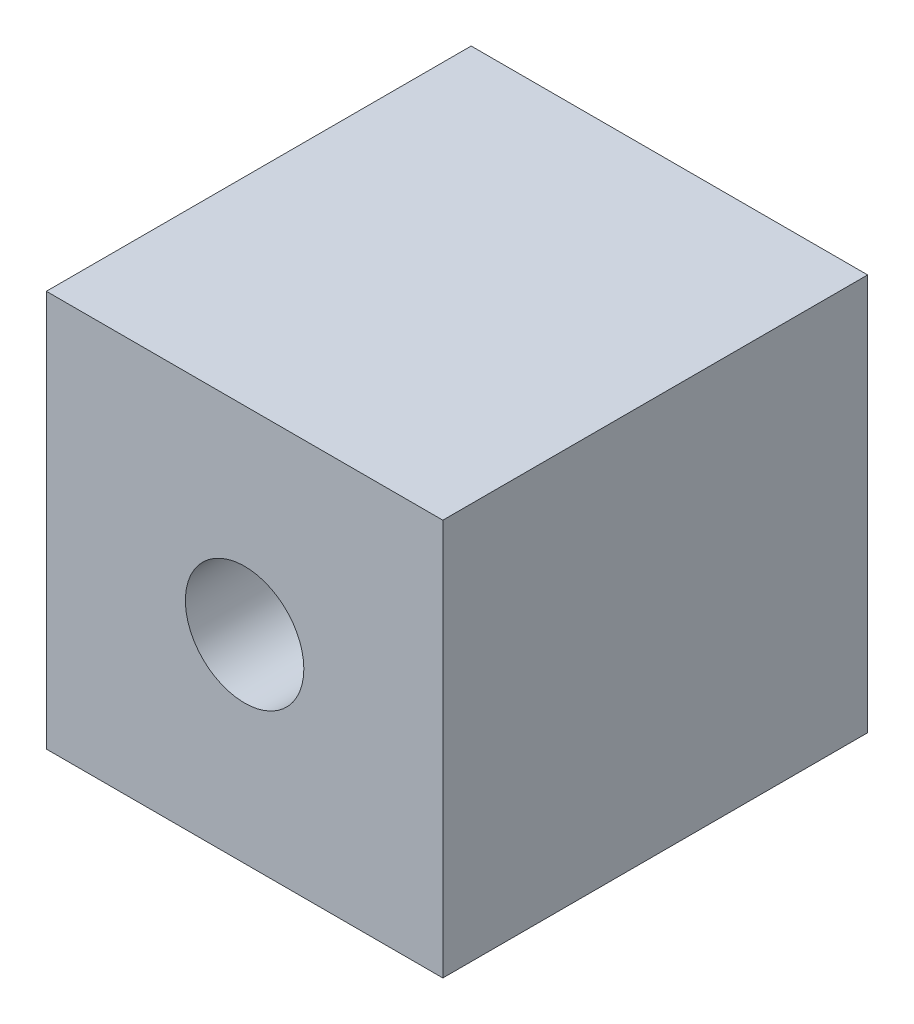
ISO-10303-21;
HEADER;
FILE_DESCRIPTION(('STEP AP214'),'2;1');
FILE_NAME('part.step','',(''),(''),'','','');
FILE_SCHEMA(('AUTOMOTIVE_DESIGN { 1 0 10303 214 1 1 1 1 }'));
ENDSEC;
DATA;
#1=APPLICATION_CONTEXT('core data for automotive mechanical design processes');
#2=APPLICATION_PROTOCOL_DEFINITION('international standard','automotive_design',2000,#1);
#3=PRODUCT_CONTEXT('',#1,'mechanical');
#4=PRODUCT('Part','Part','',(#3));
#5=PRODUCT_RELATED_PRODUCT_CATEGORY('part','',(#4));
#6=PRODUCT_DEFINITION_FORMATION('','',#4);
#7=PRODUCT_DEFINITION_CONTEXT('part definition',#1,'design');
#8=PRODUCT_DEFINITION('design','',#6,#7);
#9=PRODUCT_DEFINITION_SHAPE('','',#8);
#10=(LENGTH_UNIT() NAMED_UNIT(*) SI_UNIT(.MILLI.,.METRE.));
#11=(NAMED_UNIT(*) PLANE_ANGLE_UNIT() SI_UNIT($,.RADIAN.));
#12=(NAMED_UNIT(*) SI_UNIT($,.STERADIAN.) SOLID_ANGLE_UNIT());
#13=UNCERTAINTY_MEASURE_WITH_UNIT(LENGTH_MEASURE(1.E-05),#10,'distance_accuracy_value','');
#14=(GEOMETRIC_REPRESENTATION_CONTEXT(3) GLOBAL_UNCERTAINTY_ASSIGNED_CONTEXT((#13)) GLOBAL_UNIT_ASSIGNED_CONTEXT((#10,
#11,#12)) REPRESENTATION_CONTEXT('',''));
#15=CARTESIAN_POINT('',(0.,0.,0.));
#16=DIRECTION('',(0.,0.,1.));
#17=DIRECTION('',(1.,0.,0.));
#18=AXIS2_PLACEMENT_3D('',#15,#16,#17);
#19=CARTESIAN_POINT('',(0.,0.,-19.05));
#20=DIRECTION('',(-1.,0.,0.));
#21=DIRECTION('',(0.,0.,1.));
#22=AXIS2_PLACEMENT_3D('',#19,#20,#21);
#23=PLANE('',#22);
#24=DIRECTION('',(0.,-1.,0.));
#25=VECTOR('',#24,1.);
#26=CARTESIAN_POINT('',(0.,0.,0.));
#27=LINE('',#26,#25);
#28=CARTESIAN_POINT('',(0.,17.78,0.));
#29=VERTEX_POINT('',#28);
#30=CARTESIAN_POINT('',(0.,0.,0.));
#31=VERTEX_POINT('',#30);
#32=EDGE_CURVE('E104',#29,#31,#27,.T.);
#33=ORIENTED_EDGE('',*,*,#32,.F.);
#34=DIRECTION('',(0.,0.,1.));
#35=VECTOR('',#34,1.);
#36=CARTESIAN_POINT('',(0.,17.78,-19.05));
#37=LINE('',#36,#35);
#38=CARTESIAN_POINT('',(0.,17.78,-19.05));
#39=VERTEX_POINT('',#38);
#40=EDGE_CURVE('E11',#39,#29,#37,.T.);
#41=ORIENTED_EDGE('',*,*,#40,.F.);
#42=DIRECTION('',(0.,-1.,0.));
#43=VECTOR('',#42,1.);
#44=CARTESIAN_POINT('',(0.,0.,-19.05));
#45=LINE('',#44,#43);
#46=CARTESIAN_POINT('',(0.,0.,-19.05));
#47=VERTEX_POINT('',#46);
#48=EDGE_CURVE('E97',#39,#47,#45,.T.);
#49=ORIENTED_EDGE('',*,*,#48,.T.);
#50=DIRECTION('',(0.,0.,1.));
#51=VECTOR('',#50,1.);
#52=CARTESIAN_POINT('',(0.,0.,-19.05));
#53=LINE('',#52,#51);
#54=EDGE_CURVE('E42',#47,#31,#53,.T.);
#55=ORIENTED_EDGE('',*,*,#54,.T.);
#56=EDGE_LOOP('',(#33,#41,#49,#55));
#57=FACE_BOUND('',#56,.T.);
#58=ADVANCED_FACE('F39',(#57),#23,.T.);
#59=CARTESIAN_POINT('',(0.,17.78,-19.05));
#60=DIRECTION('',(0.,1.,0.));
#61=DIRECTION('',(0.,0.,1.));
#62=AXIS2_PLACEMENT_3D('',#59,#60,#61);
#63=PLANE('',#62);
#64=DIRECTION('',(-1.,0.,0.));
#65=VECTOR('',#64,1.);
#66=CARTESIAN_POINT('',(0.,17.78,0.));
#67=LINE('',#66,#65);
#68=CARTESIAN_POINT('',(17.78,17.78,0.));
#69=VERTEX_POINT('',#68);
#70=EDGE_CURVE('E99',#69,#29,#67,.T.);
#71=ORIENTED_EDGE('',*,*,#70,.F.);
#72=DIRECTION('',(0.,0.,1.));
#73=VECTOR('',#72,1.);
#74=CARTESIAN_POINT('',(17.78,17.78,-19.05));
#75=LINE('',#74,#73);
#76=CARTESIAN_POINT('',(17.78,17.78,-19.05));
#77=VERTEX_POINT('',#76);
#78=EDGE_CURVE('E48',#77,#69,#75,.T.);
#79=ORIENTED_EDGE('',*,*,#78,.F.);
#80=DIRECTION('',(-1.,0.,0.));
#81=VECTOR('',#80,1.);
#82=CARTESIAN_POINT('',(0.,17.78,-19.05));
#83=LINE('',#82,#81);
#84=EDGE_CURVE('E94',#77,#39,#83,.T.);
#85=ORIENTED_EDGE('',*,*,#84,.T.);
#86=ORIENTED_EDGE('',*,*,#40,.T.);
#87=EDGE_LOOP('',(#71,#79,#85,#86));
#88=FACE_BOUND('',#87,.T.);
#89=ADVANCED_FACE('F115',(#88),#63,.T.);
#90=CARTESIAN_POINT('',(17.78,0.,-19.05));
#91=DIRECTION('',(1.,0.,0.));
#92=DIRECTION('',(0.,1.,0.));
#93=AXIS2_PLACEMENT_3D('',#90,#91,#92);
#94=PLANE('',#93);
#95=DIRECTION('',(0.,1.,0.));
#96=VECTOR('',#95,1.);
#97=CARTESIAN_POINT('',(17.78,0.,0.));
#98=LINE('',#97,#96);
#99=CARTESIAN_POINT('',(17.78,0.,0.));
#100=VERTEX_POINT('',#99);
#101=EDGE_CURVE('E89',#100,#69,#98,.T.);
#102=ORIENTED_EDGE('',*,*,#101,.F.);
#103=DIRECTION('',(0.,0.,1.));
#104=VECTOR('',#103,1.);
#105=CARTESIAN_POINT('',(17.78,0.,-19.05));
#106=LINE('',#105,#104);
#107=CARTESIAN_POINT('',(17.78,0.,-19.05));
#108=VERTEX_POINT('',#107);
#109=EDGE_CURVE('E84',#108,#100,#106,.T.);
#110=ORIENTED_EDGE('',*,*,#109,.F.);
#111=DIRECTION('',(0.,1.,0.));
#112=VECTOR('',#111,1.);
#113=CARTESIAN_POINT('',(17.78,0.,-19.05));
#114=LINE('',#113,#112);
#115=EDGE_CURVE('E87',#108,#77,#114,.T.);
#116=ORIENTED_EDGE('',*,*,#115,.T.);
#117=ORIENTED_EDGE('',*,*,#78,.T.);
#118=EDGE_LOOP('',(#102,#110,#116,#117));
#119=FACE_BOUND('',#118,.T.);
#120=ADVANCED_FACE('F86',(#119),#94,.T.);
#121=CARTESIAN_POINT('',(0.,0.,-19.05));
#122=DIRECTION('',(0.,-1.,0.));
#123=DIRECTION('',(0.,0.,-1.));
#124=AXIS2_PLACEMENT_3D('',#121,#122,#123);
#125=PLANE('',#124);
#126=DIRECTION('',(1.,0.,0.));
#127=VECTOR('',#126,1.);
#128=CARTESIAN_POINT('',(0.,0.,0.));
#129=LINE('',#128,#127);
#130=EDGE_CURVE('E107',#31,#100,#129,.T.);
#131=ORIENTED_EDGE('',*,*,#130,.F.);
#132=ORIENTED_EDGE('',*,*,#54,.F.);
#133=DIRECTION('',(1.,0.,0.));
#134=VECTOR('',#133,1.);
#135=CARTESIAN_POINT('',(0.,0.,-19.05));
#136=LINE('',#135,#134);
#137=EDGE_CURVE('E93',#47,#108,#136,.T.);
#138=ORIENTED_EDGE('',*,*,#137,.T.);
#139=ORIENTED_EDGE('',*,*,#109,.T.);
#140=EDGE_LOOP('',(#131,#132,#138,#139));
#141=FACE_BOUND('',#140,.T.);
#142=ADVANCED_FACE('F96',(#141),#125,.T.);
#143=CARTESIAN_POINT('',(0.,17.78,-19.05));
#144=DIRECTION('',(0.,0.,-1.));
#145=DIRECTION('',(-1.,0.,0.));
#146=AXIS2_PLACEMENT_3D('',#143,#144,#145);
#147=PLANE('',#146);
#148=ORIENTED_EDGE('',*,*,#48,.F.);
#149=ORIENTED_EDGE('',*,*,#84,.F.);
#150=ORIENTED_EDGE('',*,*,#115,.F.);
#151=ORIENTED_EDGE('',*,*,#137,.F.);
#152=EDGE_LOOP('',(#148,#149,#150,#151));
#153=FACE_BOUND('',#152,.T.);
#154=ADVANCED_FACE('F92',(#153),#147,.T.);
#155=CARTESIAN_POINT('',(0.,17.78,0.));
#156=DIRECTION('',(0.,0.,-1.));
#157=DIRECTION('',(-1.,0.,0.));
#158=AXIS2_PLACEMENT_3D('',#155,#156,#157);
#159=PLANE('',#158);
#160=CARTESIAN_POINT('',(8.89,8.89000000000001,0.));
#161=DIRECTION('',(0.,0.,1.));
#162=DIRECTION('',(1.,0.,0.));
#163=AXIS2_PLACEMENT_3D('',#160,#161,#162);
#164=CIRCLE('',#163,2.65684);
#165=CARTESIAN_POINT('',(11.54684,8.89000000000001,0.));
#166=VERTEX_POINT('',#165);
#167=EDGE_CURVE('E145',#166,#166,#164,.T.);
#168=ORIENTED_EDGE('',*,*,#167,.F.);
#169=EDGE_LOOP('',(#168));
#170=FACE_BOUND('',#169,.T.);
#171=ORIENTED_EDGE('',*,*,#32,.T.);
#172=ORIENTED_EDGE('',*,*,#130,.T.);
#173=ORIENTED_EDGE('',*,*,#101,.T.);
#174=ORIENTED_EDGE('',*,*,#70,.T.);
#175=EDGE_LOOP('',(#171,#172,#173,#174));
#176=FACE_BOUND('',#175,.T.);
#177=ADVANCED_FACE('F114',(#170,#176),#159,.F.);
#178=CARTESIAN_POINT('',(8.89,8.89000000000001,-13.99999994));
#179=DIRECTION('',(0.,0.,1.));
#180=DIRECTION('',(1.,0.,0.));
#181=AXIS2_PLACEMENT_3D('',#178,#179,#180);
#182=CYLINDRICAL_SURFACE('',#181,2.65684);
#183=CARTESIAN_POINT('',(8.89,8.89000000000001,-13.99999994));
#184=DIRECTION('',(0.,0.,1.));
#185=DIRECTION('',(1.,0.,0.));
#186=AXIS2_PLACEMENT_3D('',#183,#184,#185);
#187=CIRCLE('',#186,2.65684);
#188=CARTESIAN_POINT('',(11.54684,8.89000000000001,-13.99999994));
#189=VERTEX_POINT('',#188);
#190=EDGE_CURVE('E108',#189,#189,#187,.T.);
#191=ORIENTED_EDGE('',*,*,#190,.F.);
#192=EDGE_LOOP('',(#191));
#193=FACE_BOUND('',#192,.T.);
#194=ORIENTED_EDGE('',*,*,#167,.T.);
#195=EDGE_LOOP('',(#194));
#196=FACE_BOUND('',#195,.T.);
#197=ADVANCED_FACE('F132',(#193,#196),#182,.F.);
#198=CARTESIAN_POINT('',(8.89,8.89000000000001,-13.99999994));
#199=DIRECTION('',(0.,0.,1.));
#200=DIRECTION('',(1.,0.,0.));
#201=AXIS2_PLACEMENT_3D('',#198,#199,#200);
#202=PLANE('',#201);
#203=ORIENTED_EDGE('',*,*,#190,.T.);
#204=EDGE_LOOP('',(#203));
#205=FACE_BOUND('',#204,.T.);
#206=ADVANCED_FACE('F137',(#205),#202,.T.);
#207=CLOSED_SHELL('',(#58,#89,#120,#142,#154,#177,#197,#206));
#208=MANIFOLD_SOLID_BREP('B2',#207);
#209=ADVANCED_BREP_SHAPE_REPRESENTATION('',(#18,#208),#14);
#210=SHAPE_DEFINITION_REPRESENTATION(#9,#209);
ENDSEC;
END-ISO-10303-21;
